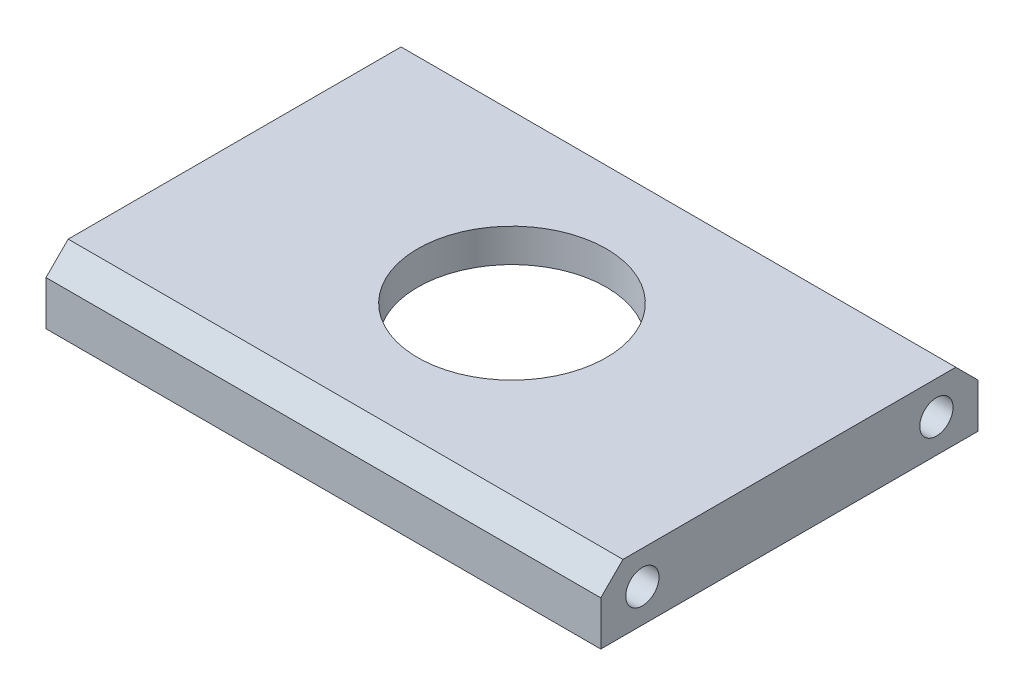
ISO-10303-21;
HEADER;
FILE_DESCRIPTION(('STEP AP214'),'2;1');
FILE_NAME('part.step','',(''),(''),'','','');
FILE_SCHEMA(('AUTOMOTIVE_DESIGN { 1 0 10303 214 1 1 1 1 }'));
ENDSEC;
DATA;
#1=APPLICATION_CONTEXT('core data for automotive mechanical design processes');
#2=APPLICATION_PROTOCOL_DEFINITION('international standard','automotive_design',2000,#1);
#3=PRODUCT_CONTEXT('',#1,'mechanical');
#4=PRODUCT('Part','Part','',(#3));
#5=PRODUCT_RELATED_PRODUCT_CATEGORY('part','',(#4));
#6=PRODUCT_DEFINITION_FORMATION('','',#4);
#7=PRODUCT_DEFINITION_CONTEXT('part definition',#1,'design');
#8=PRODUCT_DEFINITION('design','',#6,#7);
#9=PRODUCT_DEFINITION_SHAPE('','',#8);
#10=(LENGTH_UNIT() NAMED_UNIT(*) SI_UNIT(.MILLI.,.METRE.));
#11=(NAMED_UNIT(*) PLANE_ANGLE_UNIT() SI_UNIT($,.RADIAN.));
#12=(NAMED_UNIT(*) SI_UNIT($,.STERADIAN.) SOLID_ANGLE_UNIT());
#13=UNCERTAINTY_MEASURE_WITH_UNIT(LENGTH_MEASURE(1.E-05),#10,'distance_accuracy_value','');
#14=(GEOMETRIC_REPRESENTATION_CONTEXT(3) GLOBAL_UNCERTAINTY_ASSIGNED_CONTEXT((#13)) GLOBAL_UNIT_ASSIGNED_CONTEXT((#10,
#11,#12)) REPRESENTATION_CONTEXT('',''));
#15=CARTESIAN_POINT('',(0.,0.,0.));
#16=DIRECTION('',(0.,0.,1.));
#17=DIRECTION('',(1.,0.,0.));
#18=AXIS2_PLACEMENT_3D('',#15,#16,#17);
#19=CARTESIAN_POINT('',(0.,6.,0.));
#20=DIRECTION('',(1.,0.,0.));
#21=DIRECTION('',(0.,0.,-1.));
#22=AXIS2_PLACEMENT_3D('',#19,#20,#21);
#23=PLANE('',#22);
#24=CARTESIAN_POINT('',(0.,3.,-30.25));
#25=DIRECTION('',(-1.,0.,0.));
#26=DIRECTION('',(0.,0.,1.));
#27=AXIS2_PLACEMENT_3D('',#24,#25,#26);
#28=CIRCLE('',#27,1.5);
#29=CARTESIAN_POINT('',(0.,3.,-28.75));
#30=VERTEX_POINT('',#29);
#31=EDGE_CURVE('E201',#30,#30,#28,.T.);
#32=ORIENTED_EDGE('',*,*,#31,.F.);
#33=EDGE_LOOP('',(#32));
#34=FACE_BOUND('',#33,.T.);
#35=CARTESIAN_POINT('',(0.,3.,-3.75));
#36=DIRECTION('',(-1.,0.,0.));
#37=DIRECTION('',(0.,0.,1.));
#38=AXIS2_PLACEMENT_3D('',#35,#36,#37);
#39=CIRCLE('',#38,1.5);
#40=CARTESIAN_POINT('',(0.,3.,-2.25));
#41=VERTEX_POINT('',#40);
#42=EDGE_CURVE('E196',#41,#41,#39,.T.);
#43=ORIENTED_EDGE('',*,*,#42,.F.);
#44=EDGE_LOOP('',(#43));
#45=FACE_BOUND('',#44,.T.);
#46=DIRECTION('',(0.,0.,1.));
#47=VECTOR('',#46,1.);
#48=CARTESIAN_POINT('',(0.,6.,0.));
#49=LINE('',#48,#47);
#50=CARTESIAN_POINT('',(0.,6.,-32.));
#51=VERTEX_POINT('',#50);
#52=CARTESIAN_POINT('',(0.,6.,-1.99999999999999));
#53=VERTEX_POINT('',#52);
#54=EDGE_CURVE('E142',#51,#53,#49,.T.);
#55=ORIENTED_EDGE('',*,*,#54,.F.);
#56=DIRECTION('',(0.,0.707106781186548,0.707106781186548));
#57=VECTOR('',#56,1.);
#58=CARTESIAN_POINT('',(0.,6.,-32.));
#59=LINE('',#58,#57);
#60=CARTESIAN_POINT('',(0.,4.00000000000001,-34.));
#61=VERTEX_POINT('',#60);
#62=EDGE_CURVE('E159',#51,#61,#59,.F.);
#63=ORIENTED_EDGE('',*,*,#62,.T.);
#64=DIRECTION('',(0.,-1.,0.));
#65=VECTOR('',#64,1.);
#66=CARTESIAN_POINT('',(0.,6.,-34.));
#67=LINE('',#66,#65);
#68=CARTESIAN_POINT('',(0.,0.,-34.));
#69=VERTEX_POINT('',#68);
#70=EDGE_CURVE('E123',#61,#69,#67,.T.);
#71=ORIENTED_EDGE('',*,*,#70,.T.);
#72=DIRECTION('',(0.,0.,1.));
#73=VECTOR('',#72,1.);
#74=CARTESIAN_POINT('',(0.,0.,0.));
#75=LINE('',#74,#73);
#76=CARTESIAN_POINT('',(0.,0.,0.));
#77=VERTEX_POINT('',#76);
#78=EDGE_CURVE('E117',#69,#77,#75,.T.);
#79=ORIENTED_EDGE('',*,*,#78,.T.);
#80=DIRECTION('',(0.,-1.,0.));
#81=VECTOR('',#80,1.);
#82=CARTESIAN_POINT('',(0.,6.,0.));
#83=LINE('',#82,#81);
#84=CARTESIAN_POINT('',(0.,4.00000000000001,0.));
#85=VERTEX_POINT('',#84);
#86=EDGE_CURVE('E101',#85,#77,#83,.T.);
#87=ORIENTED_EDGE('',*,*,#86,.F.);
#88=DIRECTION('',(0.,-0.707106781186548,0.707106781186548));
#89=VECTOR('',#88,1.);
#90=CARTESIAN_POINT('',(0.,6.,-1.99999999999999));
#91=LINE('',#90,#89);
#92=EDGE_CURVE('E160',#85,#53,#91,.F.);
#93=ORIENTED_EDGE('',*,*,#92,.T.);
#94=EDGE_LOOP('',(#55,#63,#71,#79,#87,#93));
#95=FACE_BOUND('',#94,.T.);
#96=ADVANCED_FACE('F46',(#34,#45,#95),#23,.F.);
#97=CARTESIAN_POINT('',(0.,6.,0.));
#98=DIRECTION('',(0.,0.,-1.));
#99=DIRECTION('',(-1.,0.,0.));
#100=AXIS2_PLACEMENT_3D('',#97,#98,#99);
#101=PLANE('',#100);
#102=DIRECTION('',(0.,-1.,0.));
#103=VECTOR('',#102,1.);
#104=CARTESIAN_POINT('',(50.,6.,0.));
#105=LINE('',#104,#103);
#106=CARTESIAN_POINT('',(50.,4.00000000000001,0.));
#107=VERTEX_POINT('',#106);
#108=CARTESIAN_POINT('',(50.,0.,0.));
#109=VERTEX_POINT('',#108);
#110=EDGE_CURVE('E115',#107,#109,#105,.T.);
#111=ORIENTED_EDGE('',*,*,#110,.F.);
#112=DIRECTION('',(-1.,0.,0.));
#113=VECTOR('',#112,1.);
#114=CARTESIAN_POINT('',(0.,4.00000000000001,0.));
#115=LINE('',#114,#113);
#116=EDGE_CURVE('E11',#107,#85,#115,.T.);
#117=ORIENTED_EDGE('',*,*,#116,.T.);
#118=ORIENTED_EDGE('',*,*,#86,.T.);
#119=DIRECTION('',(1.,0.,0.));
#120=VECTOR('',#119,1.);
#121=CARTESIAN_POINT('',(0.,0.,0.));
#122=LINE('',#121,#120);
#123=EDGE_CURVE('E102',#77,#109,#122,.T.);
#124=ORIENTED_EDGE('',*,*,#123,.T.);
#125=EDGE_LOOP('',(#111,#117,#118,#124));
#126=FACE_BOUND('',#125,.T.);
#127=ADVANCED_FACE('F103',(#126),#101,.F.);
#128=CARTESIAN_POINT('',(50.,6.,0.));
#129=DIRECTION('',(-1.,0.,0.));
#130=DIRECTION('',(0.,0.,1.));
#131=AXIS2_PLACEMENT_3D('',#128,#129,#130);
#132=PLANE('',#131);
#133=CARTESIAN_POINT('',(50.,3.,-3.75));
#134=DIRECTION('',(1.,0.,0.));
#135=DIRECTION('',(0.,0.,-1.));
#136=AXIS2_PLACEMENT_3D('',#133,#134,#135);
#137=CIRCLE('',#136,1.5);
#138=CARTESIAN_POINT('',(50.,3.,-5.25));
#139=VERTEX_POINT('',#138);
#140=EDGE_CURVE('E131',#139,#139,#137,.T.);
#141=ORIENTED_EDGE('',*,*,#140,.F.);
#142=EDGE_LOOP('',(#141));
#143=FACE_BOUND('',#142,.T.);
#144=CARTESIAN_POINT('',(50.,3.,-30.25));
#145=DIRECTION('',(1.,0.,0.));
#146=DIRECTION('',(0.,0.,-1.));
#147=AXIS2_PLACEMENT_3D('',#144,#145,#146);
#148=CIRCLE('',#147,1.5);
#149=CARTESIAN_POINT('',(50.,3.,-31.75));
#150=VERTEX_POINT('',#149);
#151=EDGE_CURVE('E186',#150,#150,#148,.T.);
#152=ORIENTED_EDGE('',*,*,#151,.F.);
#153=EDGE_LOOP('',(#152));
#154=FACE_BOUND('',#153,.T.);
#155=DIRECTION('',(0.,-1.,0.));
#156=VECTOR('',#155,1.);
#157=CARTESIAN_POINT('',(50.,6.,-34.));
#158=LINE('',#157,#156);
#159=CARTESIAN_POINT('',(50.,4.00000000000001,-34.));
#160=VERTEX_POINT('',#159);
#161=CARTESIAN_POINT('',(50.,0.,-34.));
#162=VERTEX_POINT('',#161);
#163=EDGE_CURVE('E144',#160,#162,#158,.T.);
#164=ORIENTED_EDGE('',*,*,#163,.F.);
#165=DIRECTION('',(0.,-0.707106781186548,-0.707106781186548));
#166=VECTOR('',#165,1.);
#167=CARTESIAN_POINT('',(50.,6.,-32.));
#168=LINE('',#167,#166);
#169=CARTESIAN_POINT('',(50.,6.,-32.));
#170=VERTEX_POINT('',#169);
#171=EDGE_CURVE('E57',#160,#170,#168,.F.);
#172=ORIENTED_EDGE('',*,*,#171,.T.);
#173=DIRECTION('',(0.,0.,-1.));
#174=VECTOR('',#173,1.);
#175=CARTESIAN_POINT('',(50.,6.,0.));
#176=LINE('',#175,#174);
#177=CARTESIAN_POINT('',(50.,6.,-1.99999999999999));
#178=VERTEX_POINT('',#177);
#179=EDGE_CURVE('E133',#178,#170,#176,.T.);
#180=ORIENTED_EDGE('',*,*,#179,.F.);
#181=DIRECTION('',(0.,0.707106781186548,-0.707106781186548));
#182=VECTOR('',#181,1.);
#183=CARTESIAN_POINT('',(50.,6.,-1.99999999999999));
#184=LINE('',#183,#182);
#185=EDGE_CURVE('E62',#178,#107,#184,.F.);
#186=ORIENTED_EDGE('',*,*,#185,.T.);
#187=ORIENTED_EDGE('',*,*,#110,.T.);
#188=DIRECTION('',(0.,0.,-1.));
#189=VECTOR('',#188,1.);
#190=CARTESIAN_POINT('',(50.,0.,0.));
#191=LINE('',#190,#189);
#192=EDGE_CURVE('E119',#109,#162,#191,.T.);
#193=ORIENTED_EDGE('',*,*,#192,.T.);
#194=EDGE_LOOP('',(#164,#172,#180,#186,#187,#193));
#195=FACE_BOUND('',#194,.T.);
#196=ADVANCED_FACE('F166',(#143,#154,#195),#132,.F.);
#197=CARTESIAN_POINT('',(0.,6.,-34.));
#198=DIRECTION('',(0.,0.,1.));
#199=DIRECTION('',(1.,0.,0.));
#200=AXIS2_PLACEMENT_3D('',#197,#198,#199);
#201=PLANE('',#200);
#202=ORIENTED_EDGE('',*,*,#70,.F.);
#203=DIRECTION('',(1.,0.,0.));
#204=VECTOR('',#203,1.);
#205=CARTESIAN_POINT('',(0.,4.00000000000001,-34.));
#206=LINE('',#205,#204);
#207=EDGE_CURVE('E72',#61,#160,#206,.T.);
#208=ORIENTED_EDGE('',*,*,#207,.T.);
#209=ORIENTED_EDGE('',*,*,#163,.T.);
#210=DIRECTION('',(-1.,0.,0.));
#211=VECTOR('',#210,1.);
#212=CARTESIAN_POINT('',(0.,0.,-34.));
#213=LINE('',#212,#211);
#214=EDGE_CURVE('E138',#162,#69,#213,.T.);
#215=ORIENTED_EDGE('',*,*,#214,.T.);
#216=EDGE_LOOP('',(#202,#208,#209,#215));
#217=FACE_BOUND('',#216,.T.);
#218=ADVANCED_FACE('F180',(#217),#201,.F.);
#219=CARTESIAN_POINT('',(0.,6.,0.));
#220=DIRECTION('',(0.,-1.,0.));
#221=DIRECTION('',(0.,0.,-1.));
#222=AXIS2_PLACEMENT_3D('',#219,#220,#221);
#223=PLANE('',#222);
#224=CARTESIAN_POINT('',(25.,6.,-17.));
#225=DIRECTION('',(0.,-1.,0.));
#226=DIRECTION('',(0.,0.,-1.));
#227=AXIS2_PLACEMENT_3D('',#224,#225,#226);
#228=CIRCLE('',#227,8.5);
#229=CARTESIAN_POINT('',(25.,6.,-25.5));
#230=VERTEX_POINT('',#229);
#231=EDGE_CURVE('E212',#230,#230,#228,.T.);
#232=ORIENTED_EDGE('',*,*,#231,.T.);
#233=EDGE_LOOP('',(#232));
#234=FACE_BOUND('',#233,.T.);
#235=ORIENTED_EDGE('',*,*,#179,.T.);
#236=DIRECTION('',(-1.,0.,0.));
#237=VECTOR('',#236,1.);
#238=CARTESIAN_POINT('',(0.,6.,-32.));
#239=LINE('',#238,#237);
#240=EDGE_CURVE('E153',#170,#51,#239,.T.);
#241=ORIENTED_EDGE('',*,*,#240,.T.);
#242=ORIENTED_EDGE('',*,*,#54,.T.);
#243=DIRECTION('',(1.,0.,0.));
#244=VECTOR('',#243,1.);
#245=CARTESIAN_POINT('',(0.,6.,-1.99999999999999));
#246=LINE('',#245,#244);
#247=EDGE_CURVE('E112',#53,#178,#246,.T.);
#248=ORIENTED_EDGE('',*,*,#247,.T.);
#249=EDGE_LOOP('',(#235,#241,#242,#248));
#250=FACE_BOUND('',#249,.T.);
#251=ADVANCED_FACE('F172',(#234,#250),#223,.F.);
#252=CARTESIAN_POINT('',(0.,0.,0.));
#253=DIRECTION('',(0.,-1.,0.));
#254=DIRECTION('',(0.,0.,-1.));
#255=AXIS2_PLACEMENT_3D('',#252,#253,#254);
#256=PLANE('',#255);
#257=CARTESIAN_POINT('',(25.,0.,-17.));
#258=DIRECTION('',(0.,-1.,0.));
#259=DIRECTION('',(0.,0.,-1.));
#260=AXIS2_PLACEMENT_3D('',#257,#258,#259);
#261=CIRCLE('',#260,15.);
#262=CARTESIAN_POINT('',(25.,0.,-32.));
#263=VERTEX_POINT('',#262);
#264=EDGE_CURVE('E209',#263,#263,#261,.T.);
#265=ORIENTED_EDGE('',*,*,#264,.F.);
#266=EDGE_LOOP('',(#265));
#267=FACE_BOUND('',#266,.T.);
#268=ORIENTED_EDGE('',*,*,#78,.F.);
#269=ORIENTED_EDGE('',*,*,#214,.F.);
#270=ORIENTED_EDGE('',*,*,#192,.F.);
#271=ORIENTED_EDGE('',*,*,#123,.F.);
#272=EDGE_LOOP('',(#268,#269,#270,#271));
#273=FACE_BOUND('',#272,.T.);
#274=ADVANCED_FACE('F116',(#267,#273),#256,.T.);
#275=CARTESIAN_POINT('',(43.,3.,-30.25));
#276=DIRECTION('',(1.,0.,0.));
#277=DIRECTION('',(0.,0.,-1.));
#278=AXIS2_PLACEMENT_3D('',#275,#276,#277);
#279=CYLINDRICAL_SURFACE('',#278,1.5);
#280=CARTESIAN_POINT('',(43.,3.,-30.25));
#281=DIRECTION('',(1.,0.,0.));
#282=DIRECTION('',(0.,0.,-1.));
#283=AXIS2_PLACEMENT_3D('',#280,#281,#282);
#284=CIRCLE('',#283,1.5);
#285=CARTESIAN_POINT('',(43.,3.,-31.75));
#286=VERTEX_POINT('',#285);
#287=EDGE_CURVE('E185',#286,#286,#284,.T.);
#288=ORIENTED_EDGE('',*,*,#287,.F.);
#289=EDGE_LOOP('',(#288));
#290=FACE_BOUND('',#289,.T.);
#291=ORIENTED_EDGE('',*,*,#151,.T.);
#292=EDGE_LOOP('',(#291));
#293=FACE_BOUND('',#292,.T.);
#294=ADVANCED_FACE('F249',(#290,#293),#279,.F.);
#295=CARTESIAN_POINT('',(43.,3.,-30.25));
#296=DIRECTION('',(1.,0.,0.));
#297=DIRECTION('',(0.,0.,-1.));
#298=AXIS2_PLACEMENT_3D('',#295,#296,#297);
#299=PLANE('',#298);
#300=ORIENTED_EDGE('',*,*,#287,.T.);
#301=EDGE_LOOP('',(#300));
#302=FACE_BOUND('',#301,.T.);
#303=ADVANCED_FACE('F252',(#302),#299,.T.);
#304=CARTESIAN_POINT('',(43.,3.,-3.75));
#305=DIRECTION('',(1.,0.,0.));
#306=DIRECTION('',(0.,0.,-1.));
#307=AXIS2_PLACEMENT_3D('',#304,#305,#306);
#308=CYLINDRICAL_SURFACE('',#307,1.5);
#309=CARTESIAN_POINT('',(43.,3.,-3.75));
#310=DIRECTION('',(1.,0.,0.));
#311=DIRECTION('',(0.,0.,-1.));
#312=AXIS2_PLACEMENT_3D('',#309,#310,#311);
#313=CIRCLE('',#312,1.5);
#314=CARTESIAN_POINT('',(43.,3.,-5.25));
#315=VERTEX_POINT('',#314);
#316=EDGE_CURVE('E130',#315,#315,#313,.T.);
#317=ORIENTED_EDGE('',*,*,#316,.F.);
#318=EDGE_LOOP('',(#317));
#319=FACE_BOUND('',#318,.T.);
#320=ORIENTED_EDGE('',*,*,#140,.T.);
#321=EDGE_LOOP('',(#320));
#322=FACE_BOUND('',#321,.T.);
#323=ADVANCED_FACE('F300',(#319,#322),#308,.F.);
#324=CARTESIAN_POINT('',(43.,3.,-3.75));
#325=DIRECTION('',(1.,0.,0.));
#326=DIRECTION('',(0.,0.,-1.));
#327=AXIS2_PLACEMENT_3D('',#324,#325,#326);
#328=PLANE('',#327);
#329=ORIENTED_EDGE('',*,*,#316,.T.);
#330=EDGE_LOOP('',(#329));
#331=FACE_BOUND('',#330,.T.);
#332=ADVANCED_FACE('F287',(#331),#328,.T.);
#333=CARTESIAN_POINT('',(7.,3.,-3.75));
#334=DIRECTION('',(-1.,0.,0.));
#335=DIRECTION('',(0.,0.,1.));
#336=AXIS2_PLACEMENT_3D('',#333,#334,#335);
#337=CYLINDRICAL_SURFACE('',#336,1.5);
#338=CARTESIAN_POINT('',(7.,3.,-3.75));
#339=DIRECTION('',(-1.,0.,0.));
#340=DIRECTION('',(0.,0.,1.));
#341=AXIS2_PLACEMENT_3D('',#338,#339,#340);
#342=CIRCLE('',#341,1.5);
#343=CARTESIAN_POINT('',(7.,3.,-2.25));
#344=VERTEX_POINT('',#343);
#345=EDGE_CURVE('E193',#344,#344,#342,.T.);
#346=ORIENTED_EDGE('',*,*,#345,.F.);
#347=EDGE_LOOP('',(#346));
#348=FACE_BOUND('',#347,.T.);
#349=ORIENTED_EDGE('',*,*,#42,.T.);
#350=EDGE_LOOP('',(#349));
#351=FACE_BOUND('',#350,.T.);
#352=ADVANCED_FACE('F286',(#348,#351),#337,.F.);
#353=CARTESIAN_POINT('',(7.,3.,-3.75));
#354=DIRECTION('',(-1.,0.,0.));
#355=DIRECTION('',(0.,0.,1.));
#356=AXIS2_PLACEMENT_3D('',#353,#354,#355);
#357=PLANE('',#356);
#358=ORIENTED_EDGE('',*,*,#345,.T.);
#359=EDGE_LOOP('',(#358));
#360=FACE_BOUND('',#359,.T.);
#361=ADVANCED_FACE('F282',(#360),#357,.T.);
#362=CARTESIAN_POINT('',(7.,3.,-30.25));
#363=DIRECTION('',(-1.,0.,0.));
#364=DIRECTION('',(0.,0.,1.));
#365=AXIS2_PLACEMENT_3D('',#362,#363,#364);
#366=CYLINDRICAL_SURFACE('',#365,1.5);
#367=CARTESIAN_POINT('',(7.,3.,-30.25));
#368=DIRECTION('',(-1.,0.,0.));
#369=DIRECTION('',(0.,0.,1.));
#370=AXIS2_PLACEMENT_3D('',#367,#368,#369);
#371=CIRCLE('',#370,1.5);
#372=CARTESIAN_POINT('',(7.,3.,-28.75));
#373=VERTEX_POINT('',#372);
#374=EDGE_CURVE('E190',#373,#373,#371,.T.);
#375=ORIENTED_EDGE('',*,*,#374,.F.);
#376=EDGE_LOOP('',(#375));
#377=FACE_BOUND('',#376,.T.);
#378=ORIENTED_EDGE('',*,*,#31,.T.);
#379=EDGE_LOOP('',(#378));
#380=FACE_BOUND('',#379,.T.);
#381=ADVANCED_FACE('F280',(#377,#380),#366,.F.);
#382=CARTESIAN_POINT('',(7.,3.,-30.25));
#383=DIRECTION('',(-1.,0.,0.));
#384=DIRECTION('',(0.,0.,1.));
#385=AXIS2_PLACEMENT_3D('',#382,#383,#384);
#386=PLANE('',#385);
#387=ORIENTED_EDGE('',*,*,#374,.T.);
#388=EDGE_LOOP('',(#387));
#389=FACE_BOUND('',#388,.T.);
#390=ADVANCED_FACE('F272',(#389),#386,.T.);
#391=CARTESIAN_POINT('',(0.,6.,-32.));
#392=DIRECTION('',(0.,-0.707106781186548,0.707106781186548));
#393=DIRECTION('',(-1.,0.,0.));
#394=AXIS2_PLACEMENT_3D('',#391,#392,#393);
#395=PLANE('',#394);
#396=ORIENTED_EDGE('',*,*,#171,.F.);
#397=ORIENTED_EDGE('',*,*,#207,.F.);
#398=ORIENTED_EDGE('',*,*,#62,.F.);
#399=ORIENTED_EDGE('',*,*,#240,.F.);
#400=EDGE_LOOP('',(#396,#397,#398,#399));
#401=FACE_BOUND('',#400,.T.);
#402=ADVANCED_FACE('F176',(#401),#395,.F.);
#403=CARTESIAN_POINT('',(0.,6.,-1.99999999999999));
#404=DIRECTION('',(0.,-0.707106781186548,-0.707106781186548));
#405=DIRECTION('',(1.,0.,0.));
#406=AXIS2_PLACEMENT_3D('',#403,#404,#405);
#407=PLANE('',#406);
#408=ORIENTED_EDGE('',*,*,#92,.F.);
#409=ORIENTED_EDGE('',*,*,#116,.F.);
#410=ORIENTED_EDGE('',*,*,#185,.F.);
#411=ORIENTED_EDGE('',*,*,#247,.F.);
#412=EDGE_LOOP('',(#408,#409,#410,#411));
#413=FACE_BOUND('',#412,.T.);
#414=ADVANCED_FACE('F47',(#413),#407,.F.);
#415=CARTESIAN_POINT('',(25.,3.,-17.));
#416=DIRECTION('',(0.,-1.,0.));
#417=DIRECTION('',(0.,0.,-1.));
#418=AXIS2_PLACEMENT_3D('',#415,#416,#417);
#419=CYLINDRICAL_SURFACE('',#418,15.);
#420=CARTESIAN_POINT('',(25.,3.,-17.));
#421=DIRECTION('',(0.,-1.,0.));
#422=DIRECTION('',(0.,0.,-1.));
#423=AXIS2_PLACEMENT_3D('',#420,#421,#422);
#424=CIRCLE('',#423,15.);
#425=CARTESIAN_POINT('',(25.,3.,-32.));
#426=VERTEX_POINT('',#425);
#427=EDGE_CURVE('E200',#426,#426,#424,.T.);
#428=ORIENTED_EDGE('',*,*,#427,.F.);
#429=EDGE_LOOP('',(#428));
#430=FACE_BOUND('',#429,.T.);
#431=ORIENTED_EDGE('',*,*,#264,.T.);
#432=EDGE_LOOP('',(#431));
#433=FACE_BOUND('',#432,.T.);
#434=ADVANCED_FACE('F237',(#430,#433),#419,.F.);
#435=CARTESIAN_POINT('',(25.,3.,-17.));
#436=DIRECTION('',(0.,-1.,0.));
#437=DIRECTION('',(0.,0.,-1.));
#438=AXIS2_PLACEMENT_3D('',#435,#436,#437);
#439=PLANE('',#438);
#440=CARTESIAN_POINT('',(25.,3.,-17.));
#441=DIRECTION('',(0.,-1.,0.));
#442=DIRECTION('',(0.,0.,-1.));
#443=AXIS2_PLACEMENT_3D('',#440,#441,#442);
#444=CIRCLE('',#443,8.5);
#445=CARTESIAN_POINT('',(25.,3.,-25.5));
#446=VERTEX_POINT('',#445);
#447=EDGE_CURVE('E217',#446,#446,#444,.T.);
#448=ORIENTED_EDGE('',*,*,#447,.F.);
#449=EDGE_LOOP('',(#448));
#450=FACE_BOUND('',#449,.T.);
#451=ORIENTED_EDGE('',*,*,#427,.T.);
#452=EDGE_LOOP('',(#451));
#453=FACE_BOUND('',#452,.T.);
#454=ADVANCED_FACE('F229',(#450,#453),#439,.T.);
#455=CARTESIAN_POINT('',(25.,6.,-17.));
#456=DIRECTION('',(0.,-1.,0.));
#457=DIRECTION('',(0.,0.,-1.));
#458=AXIS2_PLACEMENT_3D('',#455,#456,#457);
#459=CYLINDRICAL_SURFACE('',#458,8.5);
#460=ORIENTED_EDGE('',*,*,#231,.F.);
#461=EDGE_LOOP('',(#460));
#462=FACE_BOUND('',#461,.T.);
#463=ORIENTED_EDGE('',*,*,#447,.T.);
#464=EDGE_LOOP('',(#463));
#465=FACE_BOUND('',#464,.T.);
#466=ADVANCED_FACE('F230',(#462,#465),#459,.F.);
#467=CLOSED_SHELL('',(#96,#127,#196,#218,#251,#274,#294,#303,#323,#332,#352,#361,#381,#390,#402,
#414,#434,#454,#466));
#468=MANIFOLD_SOLID_BREP('B2',#467);
#469=ADVANCED_BREP_SHAPE_REPRESENTATION('',(#18,#468),#14);
#470=SHAPE_DEFINITION_REPRESENTATION(#9,#469);
ENDSEC;
END-ISO-10303-21;
